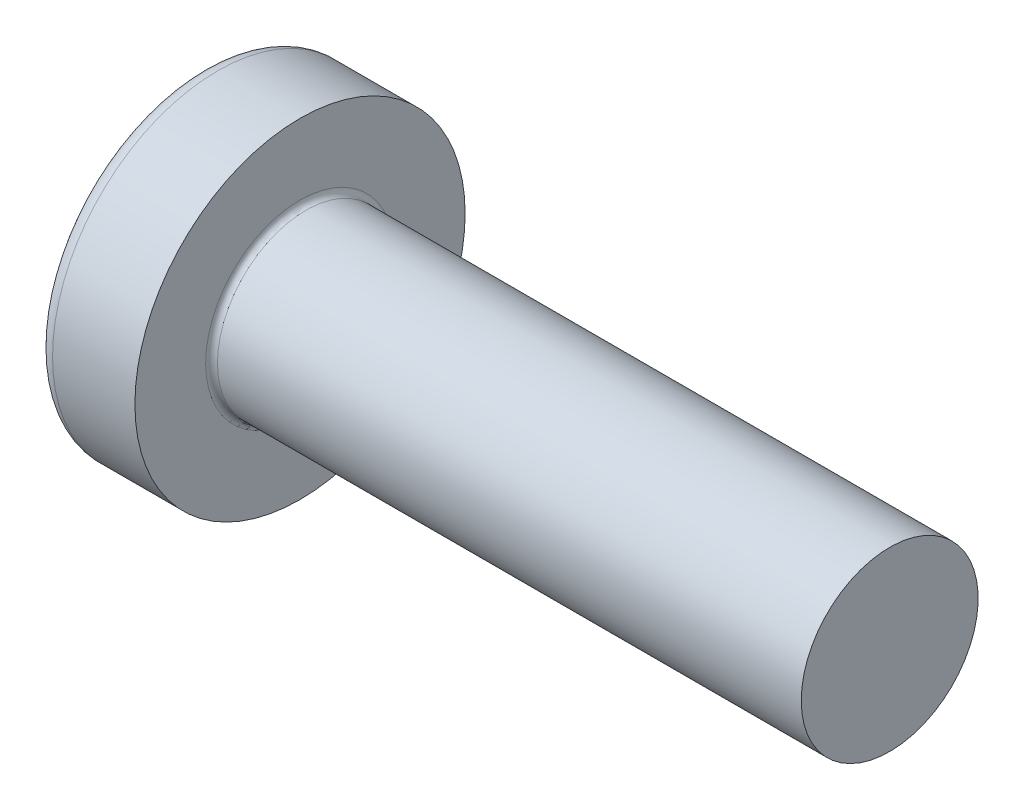
ISO-10303-21;
HEADER;
FILE_DESCRIPTION(('STEP AP214'),'2;1');
FILE_NAME('part.step','',(''),(''),'','','');
FILE_SCHEMA(('AUTOMOTIVE_DESIGN { 1 0 10303 214 1 1 1 1 }'));
ENDSEC;
DATA;
#1=APPLICATION_CONTEXT('core data for automotive mechanical design processes');
#2=APPLICATION_PROTOCOL_DEFINITION('international standard','automotive_design',2000,#1);
#3=PRODUCT_CONTEXT('',#1,'mechanical');
#4=PRODUCT('Part','Part','',(#3));
#5=PRODUCT_RELATED_PRODUCT_CATEGORY('part','',(#4));
#6=PRODUCT_DEFINITION_FORMATION('','',#4);
#7=PRODUCT_DEFINITION_CONTEXT('part definition',#1,'design');
#8=PRODUCT_DEFINITION('design','',#6,#7);
#9=PRODUCT_DEFINITION_SHAPE('','',#8);
#10=(LENGTH_UNIT() NAMED_UNIT(*) SI_UNIT(.MILLI.,.METRE.));
#11=(NAMED_UNIT(*) PLANE_ANGLE_UNIT() SI_UNIT($,.RADIAN.));
#12=(NAMED_UNIT(*) SI_UNIT($,.STERADIAN.) SOLID_ANGLE_UNIT());
#13=UNCERTAINTY_MEASURE_WITH_UNIT(LENGTH_MEASURE(1.E-05),#10,'distance_accuracy_value','');
#14=(GEOMETRIC_REPRESENTATION_CONTEXT(3) GLOBAL_UNCERTAINTY_ASSIGNED_CONTEXT((#13)) GLOBAL_UNIT_ASSIGNED_CONTEXT((#10,
#11,#12)) REPRESENTATION_CONTEXT('',''));
#15=CARTESIAN_POINT('',(0.,0.,0.));
#16=DIRECTION('',(0.,0.,1.));
#17=DIRECTION('',(1.,0.,0.));
#18=AXIS2_PLACEMENT_3D('',#15,#16,#17);
#19=CARTESIAN_POINT('',(5.,0.,0.));
#20=DIRECTION('',(-1.,0.,0.));
#21=DIRECTION('',(0.,1.,0.));
#22=AXIS2_PLACEMENT_3D('',#19,#20,#21);
#23=SPHERICAL_SURFACE('',#22,5.);
#24=CARTESIAN_POINT('',(0.775371598933733,0.,0.));
#25=DIRECTION('',(-1.,0.,0.));
#26=DIRECTION('',(0.,0.,1.));
#27=AXIS2_PLACEMENT_3D('',#24,#25,#26);
#28=CIRCLE('',#27,2.67441860465116);
#29=CARTESIAN_POINT('',(0.775371598933733,0.,2.67441860465116));
#30=VERTEX_POINT('',#29);
#31=EDGE_CURVE('E239',#30,#30,#28,.T.);
#32=ORIENTED_EDGE('',*,*,#31,.T.);
#33=EDGE_LOOP('',(#32));
#34=FACE_BOUND('',#33,.T.);
#35=CARTESIAN_POINT('',(0.0457951200896417,0.,0.));
#36=DIRECTION('',(1.,0.,0.));
#37=DIRECTION('',(0.,0.,-1.));
#38=AXIS2_PLACEMENT_3D('',#35,#36,#37);
#39=CIRCLE('',#38,0.675169614150692);
#40=CARTESIAN_POINT('',(0.0457951200896426,-0.369999999999998,-0.564760133040918));
#41=VERTEX_POINT('',#40);
#42=CARTESIAN_POINT('',(0.0457951200896417,-0.564760133040915,-0.37));
#43=VERTEX_POINT('',#42);
#44=EDGE_CURVE('E375',#41,#43,#39,.F.);
#45=ORIENTED_EDGE('',*,*,#44,.F.);
#46=CARTESIAN_POINT('',(5.,-0.37,0.));
#47=DIRECTION('',(0.,1.,0.));
#48=DIRECTION('',(0.,0.,1.));
#49=AXIS2_PLACEMENT_3D('',#46,#47,#48);
#50=CIRCLE('',#49,4.98629120689917);
#51=CARTESIAN_POINT('',(0.187869731256034,-0.369999999999995,-1.30633161051784));
#52=VERTEX_POINT('',#51);
#53=EDGE_CURVE('E301',#52,#41,#50,.T.);
#54=ORIENTED_EDGE('',*,*,#53,.F.);
#55=CARTESIAN_POINT('',(4.56358245832426,0.,0.875318202045668));
#56=DIRECTION('',(0.446197800778958,0.,-0.894934367749961));
#57=DIRECTION('',(-0.89493436774996,0.,-0.446197800778958));
#58=AXIS2_PLACEMENT_3D('',#55,#56,#57);
#59=CIRCLE('',#58,4.90340267309195);
#60=CARTESIAN_POINT('',(0.187869731256034,0.370000000000005,-1.30633161051784));
#61=VERTEX_POINT('',#60);
#62=EDGE_CURVE('E273',#52,#61,#59,.T.);
#63=ORIENTED_EDGE('',*,*,#62,.T.);
#64=CARTESIAN_POINT('',(5.,0.37,0.));
#65=DIRECTION('',(0.,-1.,0.));
#66=DIRECTION('',(0.,0.,-1.));
#67=AXIS2_PLACEMENT_3D('',#64,#65,#66);
#68=CIRCLE('',#67,4.98629120689917);
#69=CARTESIAN_POINT('',(0.0457951200896421,0.370000000000002,-0.564760133040916));
#70=VERTEX_POINT('',#69);
#71=EDGE_CURVE('E328',#70,#61,#68,.T.);
#72=ORIENTED_EDGE('',*,*,#71,.F.);
#73=CARTESIAN_POINT('',(0.0457951200896417,0.564760133040916,-0.37));
#74=VERTEX_POINT('',#73);
#75=EDGE_CURVE('E394',#74,#70,#39,.F.);
#76=ORIENTED_EDGE('',*,*,#75,.F.);
#77=CARTESIAN_POINT('',(5.,0.,-0.37));
#78=DIRECTION('',(0.,0.,1.));
#79=DIRECTION('',(1.,0.,0.));
#80=AXIS2_PLACEMENT_3D('',#77,#78,#79);
#81=CIRCLE('',#80,4.98629120689917);
#82=CARTESIAN_POINT('',(0.187869731256034,1.30633161051784,-0.37));
#83=VERTEX_POINT('',#82);
#84=EDGE_CURVE('E267',#83,#74,#81,.T.);
#85=ORIENTED_EDGE('',*,*,#84,.F.);
#86=CARTESIAN_POINT('',(4.56358245832426,-0.875318202045668,0.));
#87=DIRECTION('',(0.446197800778958,0.894934367749961,0.));
#88=DIRECTION('',(-0.89493436774996,0.446197800778958,0.));
#89=AXIS2_PLACEMENT_3D('',#86,#87,#88);
#90=CIRCLE('',#89,4.90340267309195);
#91=CARTESIAN_POINT('',(0.187869731256034,1.30633161051784,0.37));
#92=VERTEX_POINT('',#91);
#93=EDGE_CURVE('E270',#83,#92,#90,.T.);
#94=ORIENTED_EDGE('',*,*,#93,.T.);
#95=CARTESIAN_POINT('',(5.,0.,0.37));
#96=DIRECTION('',(0.,0.,-1.));
#97=DIRECTION('',(0.,1.,0.));
#98=AXIS2_PLACEMENT_3D('',#95,#96,#97);
#99=CIRCLE('',#98,4.98629120689917);
#100=CARTESIAN_POINT('',(0.0457951200896417,0.564760133040916,0.37));
#101=VERTEX_POINT('',#100);
#102=EDGE_CURVE('E263',#101,#92,#99,.T.);
#103=ORIENTED_EDGE('',*,*,#102,.F.);
#104=CARTESIAN_POINT('',(0.0457951200896426,0.369999999999998,0.564760133040918));
#105=VERTEX_POINT('',#104);
#106=EDGE_CURVE('E393',#105,#101,#39,.F.);
#107=ORIENTED_EDGE('',*,*,#106,.F.);
#108=CARTESIAN_POINT('',(0.187869731256034,0.369999999999995,1.30633161051784));
#109=VERTEX_POINT('',#108);
#110=EDGE_CURVE('E283',#109,#105,#68,.T.);
#111=ORIENTED_EDGE('',*,*,#110,.F.);
#112=CARTESIAN_POINT('',(4.56358245832426,0.,-0.875318202045668));
#113=DIRECTION('',(0.446197800778958,0.,0.894934367749961));
#114=DIRECTION('',(0.89493436774996,0.,-0.446197800778958));
#115=AXIS2_PLACEMENT_3D('',#112,#113,#114);
#116=CIRCLE('',#115,4.90340267309195);
#117=CARTESIAN_POINT('',(0.187869731256034,-0.370000000000005,1.30633161051784));
#118=VERTEX_POINT('',#117);
#119=EDGE_CURVE('E50',#109,#118,#116,.T.);
#120=ORIENTED_EDGE('',*,*,#119,.T.);
#121=CARTESIAN_POINT('',(0.0457951200896421,-0.370000000000002,0.564760133040916));
#122=VERTEX_POINT('',#121);
#123=EDGE_CURVE('E280',#122,#118,#50,.T.);
#124=ORIENTED_EDGE('',*,*,#123,.F.);
#125=CARTESIAN_POINT('',(0.0457951200896417,-0.564760133040916,0.37));
#126=VERTEX_POINT('',#125);
#127=EDGE_CURVE('E429',#126,#122,#39,.F.);
#128=ORIENTED_EDGE('',*,*,#127,.F.);
#129=CARTESIAN_POINT('',(0.187869731256034,-1.30633161051784,0.37));
#130=VERTEX_POINT('',#129);
#131=EDGE_CURVE('E264',#130,#126,#99,.T.);
#132=ORIENTED_EDGE('',*,*,#131,.F.);
#133=CARTESIAN_POINT('',(4.56358245832426,0.875318202045668,0.));
#134=DIRECTION('',(0.446197800778958,-0.894934367749961,0.));
#135=DIRECTION('',(0.89493436774996,0.446197800778958,0.));
#136=AXIS2_PLACEMENT_3D('',#133,#134,#135);
#137=CIRCLE('',#136,4.90340267309195);
#138=CARTESIAN_POINT('',(0.187869731256034,-1.30633161051784,-0.37));
#139=VERTEX_POINT('',#138);
#140=EDGE_CURVE('E260',#130,#139,#137,.T.);
#141=ORIENTED_EDGE('',*,*,#140,.T.);
#142=EDGE_CURVE('E65',#43,#139,#81,.T.);
#143=ORIENTED_EDGE('',*,*,#142,.F.);
#144=EDGE_LOOP('',(#45,#54,#63,#72,#76,#85,#94,#103,#107,#111,#120,#124,#128,#132,#141,#143));
#145=FACE_BOUND('',#144,.T.);
#146=ADVANCED_FACE('F37',(#34,#145),#23,.T.);
#147=CARTESIAN_POINT('',(1.75,0.527482216012805,-0.37));
#148=DIRECTION('',(0.,0.,1.));
#149=DIRECTION('',(1.,0.,0.));
#150=AXIS2_PLACEMENT_3D('',#147,#148,#149);
#151=PLANE('',#150);
#152=ORIENTED_EDGE('',*,*,#84,.T.);
#153=CARTESIAN_POINT('',(-0.987293237053716,0.649401255967161,-0.37));
#154=CARTESIAN_POINT('',(-0.781914975317084,0.632865887002871,-0.37));
#155=CARTESIAN_POINT('',(-0.576547882393372,0.616188977635081,-0.37));
#156=CARTESIAN_POINT('',(-0.165841599226327,0.582441031964227,-0.37));
#157=CARTESIAN_POINT('',(0.0394975903090452,0.56536998705488,-0.37));
#158=CARTESIAN_POINT('',(0.450133475422572,0.530723441326535,-0.37));
#159=CARTESIAN_POINT('',(0.655430171010573,0.513147940624557,-0.37));
#160=CARTESIAN_POINT('',(1.06596140177934,0.477314957985794,-0.37));
#161=CARTESIAN_POINT('',(1.2711959378071,0.459057485806066,-0.37));
#162=CARTESIAN_POINT('',(1.61065292365626,0.428051938688768,-0.37));
#163=CARTESIAN_POINT('',(1.74490059995643,0.415580824990931,-0.37));
#164=CARTESIAN_POINT('',(2.01334321762763,0.390092023404979,-0.37));
#165=CARTESIAN_POINT('',(2.14753815934577,0.377074339177353,-0.37));
#166=CARTESIAN_POINT('',(2.41586354151957,0.350315629452843,-0.37));
#167=CARTESIAN_POINT('',(2.5499939784531,0.33657456817765,-0.37));
#168=CARTESIAN_POINT('',(2.81814173295471,0.308004077741875,-0.37));
#169=CARTESIAN_POINT('',(2.95215904765134,0.293174621747065,-0.37));
#170=CARTESIAN_POINT('',(3.0860955068368,0.277618485071816,-0.37));
#171=B_SPLINE_CURVE_WITH_KNOTS('',3,(#153,#154,#155,#156,#157,#158,#159,#160,#161,#162,#163,
#164,#165,#166,#167,#168,#169,#170),.UNSPECIFIED.,.F.,.F.,(4,2,2,2,2,2,2,2,4),(0.,
0.618128793984691,1.23627109812525,1.85441325887562,2.4725465791681,2.87702276218609,
3.28149623678161,3.68598973550942,4.09049321032311),.UNSPECIFIED.);
#172=CARTESIAN_POINT('',(1.75,0.415013252800437,-0.37));
#173=VERTEX_POINT('',#172);
#174=EDGE_CURVE('E415',#74,#173,#171,.T.);
#175=ORIENTED_EDGE('',*,*,#174,.T.);
#176=DIRECTION('',(0.,1.,0.));
#177=VECTOR('',#176,1.);
#178=CARTESIAN_POINT('',(1.75,-0.527482216012805,-0.37));
#179=LINE('',#178,#177);
#180=CARTESIAN_POINT('',(1.75,0.527482216012805,-0.37));
#181=VERTEX_POINT('',#180);
#182=EDGE_CURVE('E357',#173,#181,#179,.T.);
#183=ORIENTED_EDGE('',*,*,#182,.T.);
#184=DIRECTION('',(0.89493436774996,-0.446197800778958,0.));
#185=VECTOR('',#184,1.);
#186=CARTESIAN_POINT('',(0.,1.4,-0.37));
#187=LINE('',#186,#185);
#188=EDGE_CURVE('E240',#83,#181,#187,.T.);
#189=ORIENTED_EDGE('',*,*,#188,.F.);
#190=EDGE_LOOP('',(#152,#175,#183,#189));
#191=FACE_BOUND('',#190,.T.);
#192=ADVANCED_FACE('F195',(#191),#151,.T.);
#193=CARTESIAN_POINT('',(1.75,-0.527482216012805,-0.37));
#194=VERTEX_POINT('',#193);
#195=CARTESIAN_POINT('',(1.75,-0.415013252800437,-0.37));
#196=VERTEX_POINT('',#195);
#197=EDGE_CURVE('E248',#194,#196,#179,.T.);
#198=ORIENTED_EDGE('',*,*,#197,.T.);
#199=CARTESIAN_POINT('',(-0.987293237053716,-0.649401255967161,-0.37));
#200=CARTESIAN_POINT('',(-0.781914975317084,-0.632865887002871,-0.37));
#201=CARTESIAN_POINT('',(-0.576547882393372,-0.616188977635081,-0.37));
#202=CARTESIAN_POINT('',(-0.165841599226327,-0.582441031964227,-0.37));
#203=CARTESIAN_POINT('',(0.0394975903090452,-0.56536998705488,-0.37));
#204=CARTESIAN_POINT('',(0.450133475422572,-0.530723441326535,-0.37));
#205=CARTESIAN_POINT('',(0.655430171010573,-0.513147940624557,-0.37));
#206=CARTESIAN_POINT('',(1.06596140177934,-0.477314957985794,-0.37));
#207=CARTESIAN_POINT('',(1.2711959378071,-0.459057485806066,-0.37));
#208=CARTESIAN_POINT('',(1.61065292365626,-0.428051938688768,-0.37));
#209=CARTESIAN_POINT('',(1.74490059995643,-0.415580824990931,-0.37));
#210=CARTESIAN_POINT('',(2.01334321762763,-0.390092023404979,-0.37));
#211=CARTESIAN_POINT('',(2.14753815934577,-0.377074339177353,-0.37));
#212=CARTESIAN_POINT('',(2.41586354151957,-0.350315629452843,-0.37));
#213=CARTESIAN_POINT('',(2.5499939784531,-0.33657456817765,-0.37));
#214=CARTESIAN_POINT('',(2.81814173295471,-0.308004077741875,-0.37));
#215=CARTESIAN_POINT('',(2.95215904765134,-0.293174621747065,-0.37));
#216=CARTESIAN_POINT('',(3.0860955068368,-0.277618485071816,-0.37));
#217=B_SPLINE_CURVE_WITH_KNOTS('',3,(#199,#200,#201,#202,#203,#204,#205,#206,#207,#208,#209,
#210,#211,#212,#213,#214,#215,#216),.UNSPECIFIED.,.F.,.F.,(4,2,2,2,2,2,2,2,4),(0.,
0.618128793984691,1.23627109812525,1.85441325887562,2.4725465791681,2.87702276218609,
3.28149623678161,3.68598973550942,4.09049321032311),.UNSPECIFIED.);
#218=EDGE_CURVE('E392',#196,#43,#217,.F.);
#219=ORIENTED_EDGE('',*,*,#218,.T.);
#220=ORIENTED_EDGE('',*,*,#142,.T.);
#221=DIRECTION('',(0.89493436774996,0.446197800778958,0.));
#222=VECTOR('',#221,1.);
#223=CARTESIAN_POINT('',(0.,-1.4,-0.37));
#224=LINE('',#223,#222);
#225=EDGE_CURVE('E331',#139,#194,#224,.T.);
#226=ORIENTED_EDGE('',*,*,#225,.T.);
#227=EDGE_LOOP('',(#198,#219,#220,#226));
#228=FACE_BOUND('',#227,.T.);
#229=ADVANCED_FACE('F201',(#228),#151,.T.);
#230=CARTESIAN_POINT('',(1.75,-0.527482216012805,0.37));
#231=DIRECTION('',(0.,0.,-1.));
#232=DIRECTION('',(0.,1.,0.));
#233=AXIS2_PLACEMENT_3D('',#230,#231,#232);
#234=PLANE('',#233);
#235=DIRECTION('',(0.,-1.,0.));
#236=VECTOR('',#235,1.);
#237=CARTESIAN_POINT('',(1.75,0.527482216012805,0.37));
#238=LINE('',#237,#236);
#239=CARTESIAN_POINT('',(1.75,0.527482216012805,0.37));
#240=VERTEX_POINT('',#239);
#241=CARTESIAN_POINT('',(1.75,0.415013252800437,0.37));
#242=VERTEX_POINT('',#241);
#243=EDGE_CURVE('E340',#240,#242,#238,.T.);
#244=ORIENTED_EDGE('',*,*,#243,.T.);
#245=CARTESIAN_POINT('',(-0.987293237069635,0.649401255968442,0.37));
#246=CARTESIAN_POINT('',(-0.781914975331301,0.632865887004023,0.37));
#247=CARTESIAN_POINT('',(-0.576547882405888,0.616188977636102,0.37));
#248=CARTESIAN_POINT('',(-0.16584159923544,0.582441031964983,0.37));
#249=CARTESIAN_POINT('',(0.0394975903016338,0.5653699870555,0.37));
#250=CARTESIAN_POINT('',(0.450133475420601,0.530723441326706,0.37));
#251=CARTESIAN_POINT('',(0.655430171012341,0.513147940624409,0.37));
#252=CARTESIAN_POINT('',(1.06596140178858,0.477314957984981,0.37));
#253=CARTESIAN_POINT('',(1.27119593782008,0.459057485804908,0.37));
#254=CARTESIAN_POINT('',(1.61065292367297,0.428051938687225,0.37));
#255=CARTESIAN_POINT('',(1.74490059997313,0.415580824989367,0.37));
#256=CARTESIAN_POINT('',(2.01334321764434,0.39009202340337,0.37));
#257=CARTESIAN_POINT('',(2.14753815936247,0.377074339175718,0.37));
#258=CARTESIAN_POINT('',(2.41586354153627,0.350315629451146,0.37));
#259=CARTESIAN_POINT('',(2.54999397846979,0.336574568175918,0.37));
#260=CARTESIAN_POINT('',(2.8181417329714,0.308004077740054,0.37));
#261=CARTESIAN_POINT('',(2.95215904766802,0.29317462174519,0.37));
#262=CARTESIAN_POINT('',(3.08609550685347,0.277618485069873,0.37));
#263=B_SPLINE_CURVE_WITH_KNOTS('',3,(#245,#246,#247,#248,#249,#250,#251,#252,#253,#254,#255,
#256,#257,#258,#259,#260,#261,#262),.UNSPECIFIED.,.F.,.F.,(4,2,2,2,2,2,2,2,4),(0.,
0.61812879398981,1.23627109813549,1.85441325889711,2.47254657920086,2.87702276221884,
3.28149623681436,3.68598973554218,4.09049321035586),.UNSPECIFIED.);
#264=EDGE_CURVE('E667',#242,#101,#263,.F.);
#265=ORIENTED_EDGE('',*,*,#264,.T.);
#266=ORIENTED_EDGE('',*,*,#102,.T.);
#267=DIRECTION('',(0.89493436774996,-0.446197800778958,0.));
#268=VECTOR('',#267,1.);
#269=CARTESIAN_POINT('',(0.,1.4,0.37));
#270=LINE('',#269,#268);
#271=EDGE_CURVE('E245',#92,#240,#270,.T.);
#272=ORIENTED_EDGE('',*,*,#271,.T.);
#273=EDGE_LOOP('',(#244,#265,#266,#272));
#274=FACE_BOUND('',#273,.T.);
#275=ADVANCED_FACE('F411',(#274),#234,.T.);
#276=ORIENTED_EDGE('',*,*,#131,.T.);
#277=CARTESIAN_POINT('',(-0.987293237069635,-0.649401255968442,0.37));
#278=CARTESIAN_POINT('',(-0.781914975331301,-0.632865887004023,0.37));
#279=CARTESIAN_POINT('',(-0.576547882405888,-0.616188977636102,0.37));
#280=CARTESIAN_POINT('',(-0.16584159923544,-0.582441031964983,0.37));
#281=CARTESIAN_POINT('',(0.0394975903016338,-0.5653699870555,0.37));
#282=CARTESIAN_POINT('',(0.450133475420601,-0.530723441326706,0.37));
#283=CARTESIAN_POINT('',(0.655430171012341,-0.513147940624409,0.37));
#284=CARTESIAN_POINT('',(1.06596140178858,-0.477314957984981,0.37));
#285=CARTESIAN_POINT('',(1.27119593782008,-0.459057485804908,0.37));
#286=CARTESIAN_POINT('',(1.61065292367297,-0.428051938687225,0.37));
#287=CARTESIAN_POINT('',(1.74490059997313,-0.415580824989367,0.37));
#288=CARTESIAN_POINT('',(2.01334321764434,-0.390092023403371,0.37));
#289=CARTESIAN_POINT('',(2.14753815936247,-0.377074339175718,0.37));
#290=CARTESIAN_POINT('',(2.41586354153627,-0.350315629451146,0.37));
#291=CARTESIAN_POINT('',(2.54999397846979,-0.336574568175918,0.37));
#292=CARTESIAN_POINT('',(2.8181417329714,-0.308004077740054,0.37));
#293=CARTESIAN_POINT('',(2.95215904766802,-0.29317462174519,0.37));
#294=CARTESIAN_POINT('',(3.08609550685347,-0.277618485069873,0.37));
#295=B_SPLINE_CURVE_WITH_KNOTS('',3,(#277,#278,#279,#280,#281,#282,#283,#284,#285,#286,#287,
#288,#289,#290,#291,#292,#293,#294),.UNSPECIFIED.,.F.,.F.,(4,2,2,2,2,2,2,2,4),(0.,
0.61812879398981,1.23627109813549,1.85441325889711,2.47254657920086,2.87702276221884,
3.28149623681436,3.68598973554218,4.09049321035586),.UNSPECIFIED.);
#296=CARTESIAN_POINT('',(1.75,-0.415013252800437,0.37));
#297=VERTEX_POINT('',#296);
#298=EDGE_CURVE('E430',#126,#297,#295,.T.);
#299=ORIENTED_EDGE('',*,*,#298,.T.);
#300=CARTESIAN_POINT('',(1.75,-0.527482216012806,0.37));
#301=VERTEX_POINT('',#300);
#302=EDGE_CURVE('E342',#297,#301,#238,.T.);
#303=ORIENTED_EDGE('',*,*,#302,.T.);
#304=DIRECTION('',(0.89493436774996,0.446197800778958,0.));
#305=VECTOR('',#304,1.);
#306=CARTESIAN_POINT('',(0.,-1.4,0.37));
#307=LINE('',#306,#305);
#308=EDGE_CURVE('E333',#130,#301,#307,.T.);
#309=ORIENTED_EDGE('',*,*,#308,.F.);
#310=EDGE_LOOP('',(#276,#299,#303,#309));
#311=FACE_BOUND('',#310,.T.);
#312=ADVANCED_FACE('F521',(#311),#234,.T.);
#313=CARTESIAN_POINT('',(1.75,0.527482216012805,0.37));
#314=DIRECTION('',(0.446197800778958,0.894934367749961,0.));
#315=DIRECTION('',(-0.89493436774996,0.446197800778958,0.));
#316=AXIS2_PLACEMENT_3D('',#313,#314,#315);
#317=PLANE('',#316);
#318=CARTESIAN_POINT('',(2.66965234556629,0.0689604865315898,0.));
#319=DIRECTION('',(0.446197800778958,0.894934367749961,0.));
#320=DIRECTION('',(-0.89493436774996,0.446197800778958,0.));
#321=AXIS2_PLACEMENT_3D('',#318,#319,#320);
#322=ELLIPSE('',#321,1.10195891266117,0.486831719863514);
#323=CARTESIAN_POINT('',(1.75,0.527482216012806,0.175779725196677));
#324=VERTEX_POINT('',#323);
#325=CARTESIAN_POINT('',(1.75,0.527482216012806,-0.175779725196677));
#326=VERTEX_POINT('',#325);
#327=EDGE_CURVE('E306',#324,#326,#322,.F.);
#328=ORIENTED_EDGE('',*,*,#327,.F.);
#329=DIRECTION('',(0.,0.,-1.));
#330=VECTOR('',#329,1.);
#331=CARTESIAN_POINT('',(1.75,0.527482216012805,0.37));
#332=LINE('',#331,#330);
#333=EDGE_CURVE('E343',#240,#324,#332,.T.);
#334=ORIENTED_EDGE('',*,*,#333,.F.);
#335=ORIENTED_EDGE('',*,*,#271,.F.);
#336=ORIENTED_EDGE('',*,*,#93,.F.);
#337=ORIENTED_EDGE('',*,*,#188,.T.);
#338=EDGE_CURVE('E345',#326,#181,#332,.T.);
#339=ORIENTED_EDGE('',*,*,#338,.F.);
#340=EDGE_LOOP('',(#328,#334,#335,#336,#337,#339));
#341=FACE_BOUND('',#340,.T.);
#342=ADVANCED_FACE('F409',(#341),#317,.F.);
#343=CARTESIAN_POINT('',(0.,-1.4,-0.37));
#344=DIRECTION('',(0.446197800778958,-0.894934367749961,0.));
#345=DIRECTION('',(0.89493436774996,0.446197800778958,0.));
#346=AXIS2_PLACEMENT_3D('',#343,#344,#345);
#347=PLANE('',#346);
#348=CARTESIAN_POINT('',(2.66965234556629,-0.0689604865315897,0.));
#349=DIRECTION('',(0.446197800778958,-0.894934367749961,0.));
#350=DIRECTION('',(-0.89493436774996,-0.446197800778958,0.));
#351=AXIS2_PLACEMENT_3D('',#348,#349,#350);
#352=ELLIPSE('',#351,1.10195891266117,0.486831719863514);
#353=CARTESIAN_POINT('',(1.75,-0.527482216012806,-0.175779725196677));
#354=VERTEX_POINT('',#353);
#355=CARTESIAN_POINT('',(1.75,-0.527482216012806,0.175779725196677));
#356=VERTEX_POINT('',#355);
#357=EDGE_CURVE('E669',#354,#356,#352,.F.);
#358=ORIENTED_EDGE('',*,*,#357,.F.);
#359=DIRECTION('',(0.,0.,1.));
#360=VECTOR('',#359,1.);
#361=CARTESIAN_POINT('',(1.75,-0.527482216012805,-0.37));
#362=LINE('',#361,#360);
#363=EDGE_CURVE('E336',#194,#354,#362,.T.);
#364=ORIENTED_EDGE('',*,*,#363,.F.);
#365=ORIENTED_EDGE('',*,*,#225,.F.);
#366=ORIENTED_EDGE('',*,*,#140,.F.);
#367=ORIENTED_EDGE('',*,*,#308,.T.);
#368=EDGE_CURVE('E339',#356,#301,#362,.T.);
#369=ORIENTED_EDGE('',*,*,#368,.F.);
#370=EDGE_LOOP('',(#358,#364,#365,#366,#367,#369));
#371=FACE_BOUND('',#370,.T.);
#372=ADVANCED_FACE('F508',(#371),#347,.F.);
#373=CARTESIAN_POINT('',(1.75,0.527482216012805,-0.37));
#374=DIRECTION('',(-1.,0.,0.));
#375=DIRECTION('',(0.,0.,1.));
#376=AXIS2_PLACEMENT_3D('',#373,#374,#375);
#377=PLANE('',#376);
#378=DIRECTION('',(0.,1.,0.));
#379=VECTOR('',#378,1.);
#380=CARTESIAN_POINT('',(1.75,-0.370000000000002,0.527482216012804));
#381=LINE('',#380,#379);
#382=CARTESIAN_POINT('',(1.75,-0.370000000000002,0.527482216012804));
#383=VERTEX_POINT('',#382);
#384=CARTESIAN_POINT('',(1.75,-0.175779725196681,0.527482216012805));
#385=VERTEX_POINT('',#384);
#386=EDGE_CURVE('E321',#383,#385,#381,.T.);
#387=ORIENTED_EDGE('',*,*,#386,.T.);
#388=CARTESIAN_POINT('',(1.75,0.,0.));
#389=DIRECTION('',(-1.,0.,0.));
#390=DIRECTION('',(0.,0.,1.));
#391=AXIS2_PLACEMENT_3D('',#388,#389,#390);
#392=CIRCLE('',#391,0.556);
#393=CARTESIAN_POINT('',(1.75,-0.370000000000001,0.415013252800436));
#394=VERTEX_POINT('',#393);
#395=EDGE_CURVE('E695',#394,#385,#392,.T.);
#396=ORIENTED_EDGE('',*,*,#395,.F.);
#397=DIRECTION('',(0.,0.,-1.));
#398=VECTOR('',#397,1.);
#399=CARTESIAN_POINT('',(1.75,-0.370000000000002,0.527482216012804));
#400=LINE('',#399,#398);
#401=EDGE_CURVE('E317',#383,#394,#400,.T.);
#402=ORIENTED_EDGE('',*,*,#401,.F.);
#403=EDGE_LOOP('',(#387,#396,#402));
#404=FACE_BOUND('',#403,.T.);
#405=ADVANCED_FACE('F465',(#404),#377,.T.);
#406=ORIENTED_EDGE('',*,*,#302,.F.);
#407=EDGE_CURVE('E700',#356,#297,#392,.T.);
#408=ORIENTED_EDGE('',*,*,#407,.F.);
#409=ORIENTED_EDGE('',*,*,#368,.T.);
#410=EDGE_LOOP('',(#406,#408,#409));
#411=FACE_BOUND('',#410,.T.);
#412=ADVANCED_FACE('F495',(#411),#377,.T.);
#413=ORIENTED_EDGE('',*,*,#363,.T.);
#414=EDGE_CURVE('E386',#196,#354,#392,.T.);
#415=ORIENTED_EDGE('',*,*,#414,.F.);
#416=ORIENTED_EDGE('',*,*,#197,.F.);
#417=EDGE_LOOP('',(#413,#415,#416));
#418=FACE_BOUND('',#417,.T.);
#419=ADVANCED_FACE('F489',(#418),#377,.T.);
#420=CARTESIAN_POINT('',(1.75,-0.369999999999998,-0.415013252800438));
#421=VERTEX_POINT('',#420);
#422=CARTESIAN_POINT('',(1.75,-0.369999999999998,-0.527482216012807));
#423=VERTEX_POINT('',#422);
#424=EDGE_CURVE('E320',#421,#423,#400,.T.);
#425=ORIENTED_EDGE('',*,*,#424,.F.);
#426=CARTESIAN_POINT('',(1.75,-0.175779725196678,-0.527482216012806));
#427=VERTEX_POINT('',#426);
#428=EDGE_CURVE('E57',#427,#421,#392,.T.);
#429=ORIENTED_EDGE('',*,*,#428,.F.);
#430=DIRECTION('',(0.,-1.,0.));
#431=VECTOR('',#430,1.);
#432=CARTESIAN_POINT('',(1.75,0.370000000000002,-0.527482216012804));
#433=LINE('',#432,#431);
#434=EDGE_CURVE('E316',#427,#423,#433,.T.);
#435=ORIENTED_EDGE('',*,*,#434,.T.);
#436=EDGE_LOOP('',(#425,#429,#435));
#437=FACE_BOUND('',#436,.T.);
#438=ADVANCED_FACE('F381',(#437),#377,.T.);
#439=CARTESIAN_POINT('',(1.75,0.370000000000002,-0.527482216012804));
#440=VERTEX_POINT('',#439);
#441=CARTESIAN_POINT('',(1.75,0.175779725196681,-0.527482216012805));
#442=VERTEX_POINT('',#441);
#443=EDGE_CURVE('E313',#440,#442,#433,.T.);
#444=ORIENTED_EDGE('',*,*,#443,.T.);
#445=CARTESIAN_POINT('',(1.75,0.370000000000001,-0.415013252800436));
#446=VERTEX_POINT('',#445);
#447=EDGE_CURVE('E385',#446,#442,#392,.T.);
#448=ORIENTED_EDGE('',*,*,#447,.F.);
#449=DIRECTION('',(0.,0.,1.));
#450=VECTOR('',#449,1.);
#451=CARTESIAN_POINT('',(1.75,0.370000000000002,-0.527482216012804));
#452=LINE('',#451,#450);
#453=EDGE_CURVE('E325',#440,#446,#452,.T.);
#454=ORIENTED_EDGE('',*,*,#453,.F.);
#455=EDGE_LOOP('',(#444,#448,#454));
#456=FACE_BOUND('',#455,.T.);
#457=ADVANCED_FACE('F477',(#456),#377,.T.);
#458=ORIENTED_EDGE('',*,*,#182,.F.);
#459=EDGE_CURVE('E684',#326,#173,#392,.T.);
#460=ORIENTED_EDGE('',*,*,#459,.F.);
#461=ORIENTED_EDGE('',*,*,#338,.T.);
#462=EDGE_LOOP('',(#458,#460,#461));
#463=FACE_BOUND('',#462,.T.);
#464=ADVANCED_FACE('F471',(#463),#377,.T.);
#465=ORIENTED_EDGE('',*,*,#333,.T.);
#466=EDGE_CURVE('E686',#242,#324,#392,.T.);
#467=ORIENTED_EDGE('',*,*,#466,.F.);
#468=ORIENTED_EDGE('',*,*,#243,.F.);
#469=EDGE_LOOP('',(#465,#467,#468));
#470=FACE_BOUND('',#469,.T.);
#471=ADVANCED_FACE('F463',(#470),#377,.T.);
#472=CARTESIAN_POINT('',(1.75,0.369999999999999,0.415013252800439));
#473=VERTEX_POINT('',#472);
#474=CARTESIAN_POINT('',(1.75,0.369999999999998,0.527482216012807));
#475=VERTEX_POINT('',#474);
#476=EDGE_CURVE('E298',#473,#475,#452,.T.);
#477=ORIENTED_EDGE('',*,*,#476,.F.);
#478=CARTESIAN_POINT('',(1.75,0.175779725196677,0.527482216012806));
#479=VERTEX_POINT('',#478);
#480=EDGE_CURVE('E387',#479,#473,#392,.T.);
#481=ORIENTED_EDGE('',*,*,#480,.F.);
#482=EDGE_CURVE('E324',#479,#475,#381,.T.);
#483=ORIENTED_EDGE('',*,*,#482,.T.);
#484=EDGE_LOOP('',(#477,#481,#483));
#485=FACE_BOUND('',#484,.T.);
#486=ADVANCED_FACE('F457',(#485),#377,.T.);
#487=CARTESIAN_POINT('',(1.75,0.369999999999998,0.527482216012807));
#488=DIRECTION('',(0.,-1.,0.));
#489=DIRECTION('',(1.,0.,0.));
#490=AXIS2_PLACEMENT_3D('',#487,#488,#489);
#491=PLANE('',#490);
#492=ORIENTED_EDGE('',*,*,#110,.T.);
#493=CARTESIAN_POINT('',(-0.987293237069635,0.369999999999998,0.649401255968443));
#494=CARTESIAN_POINT('',(-0.781914975331301,0.369999999999998,0.632865887004024));
#495=CARTESIAN_POINT('',(-0.576547882405888,0.369999999999998,0.616188977636103));
#496=CARTESIAN_POINT('',(-0.16584159923544,0.369999999999998,0.582441031964984));
#497=CARTESIAN_POINT('',(0.0394975903016338,0.369999999999998,0.565369987055501));
#498=CARTESIAN_POINT('',(0.450133475420601,0.369999999999998,0.530723441326707));
#499=CARTESIAN_POINT('',(0.655430171012341,0.369999999999998,0.51314794062441));
#500=CARTESIAN_POINT('',(1.06596140178858,0.369999999999998,0.477314957984982));
#501=CARTESIAN_POINT('',(1.27119593782008,0.369999999999998,0.459057485804909));
#502=CARTESIAN_POINT('',(1.61065292367297,0.369999999999999,0.428051938687226));
#503=CARTESIAN_POINT('',(1.74490059997313,0.369999999999999,0.415580824989369));
#504=CARTESIAN_POINT('',(2.01334321764434,0.369999999999999,0.390092023403372));
#505=CARTESIAN_POINT('',(2.14753815936247,0.369999999999999,0.37707433917572));
#506=CARTESIAN_POINT('',(2.41586354153627,0.369999999999999,0.350315629451147));
#507=CARTESIAN_POINT('',(2.54999397846979,0.369999999999999,0.336574568175919));
#508=CARTESIAN_POINT('',(2.8181417329714,0.369999999999999,0.308004077740055));
#509=CARTESIAN_POINT('',(2.95215904766802,0.369999999999999,0.293174621745191));
#510=CARTESIAN_POINT('',(3.08609550685347,0.369999999999999,0.277618485069875));
#511=B_SPLINE_CURVE_WITH_KNOTS('',3,(#493,#494,#495,#496,#497,#498,#499,#500,#501,#502,#503,
#504,#505,#506,#507,#508,#509,#510),.UNSPECIFIED.,.F.,.F.,(4,2,2,2,2,2,2,2,4),(0.,
0.61812879398981,1.23627109813549,1.85441325889711,2.47254657920086,2.87702276221884,
3.28149623681436,3.68598973554218,4.09049321035586),.UNSPECIFIED.);
#512=EDGE_CURVE('E666',#105,#473,#511,.T.);
#513=ORIENTED_EDGE('',*,*,#512,.T.);
#514=ORIENTED_EDGE('',*,*,#476,.T.);
#515=DIRECTION('',(0.89493436774996,0.,-0.446197800778958));
#516=VECTOR('',#515,1.);
#517=CARTESIAN_POINT('',(0.,0.369999999999995,1.4));
#518=LINE('',#517,#516);
#519=EDGE_CURVE('E291',#109,#475,#518,.T.);
#520=ORIENTED_EDGE('',*,*,#519,.F.);
#521=EDGE_LOOP('',(#492,#513,#514,#520));
#522=FACE_BOUND('',#521,.T.);
#523=ADVANCED_FACE('F295',(#522),#491,.T.);
#524=CARTESIAN_POINT('',(1.75,-0.369999999999998,-0.527482216012807));
#525=DIRECTION('',(0.,1.,0.));
#526=DIRECTION('',(0.,0.,1.));
#527=AXIS2_PLACEMENT_3D('',#524,#525,#526);
#528=PLANE('',#527);
#529=ORIENTED_EDGE('',*,*,#401,.T.);
#530=CARTESIAN_POINT('',(-0.987293237053716,-0.370000000000002,0.649401255967159));
#531=CARTESIAN_POINT('',(-0.781914975317084,-0.370000000000002,0.63286588700287));
#532=CARTESIAN_POINT('',(-0.576547882393372,-0.370000000000002,0.616188977635079));
#533=CARTESIAN_POINT('',(-0.165841599226327,-0.370000000000002,0.582441031964225));
#534=CARTESIAN_POINT('',(0.039497590309045,-0.370000000000002,0.565369987054878));
#535=CARTESIAN_POINT('',(0.450133475422572,-0.370000000000002,0.530723441326534));
#536=CARTESIAN_POINT('',(0.655430171010573,-0.370000000000002,0.513147940624556));
#537=CARTESIAN_POINT('',(1.06596140177934,-0.370000000000002,0.477314957985792));
#538=CARTESIAN_POINT('',(1.2711959378071,-0.370000000000002,0.459057485806065));
#539=CARTESIAN_POINT('',(1.61065292365626,-0.370000000000001,0.428051938688767));
#540=CARTESIAN_POINT('',(1.74490059995642,-0.370000000000001,0.41558082499093));
#541=CARTESIAN_POINT('',(2.01334321762763,-0.370000000000001,0.390092023404978));
#542=CARTESIAN_POINT('',(2.14753815934577,-0.370000000000001,0.377074339177352));
#543=CARTESIAN_POINT('',(2.41586354151957,-0.370000000000001,0.350315629452841));
#544=CARTESIAN_POINT('',(2.5499939784531,-0.370000000000001,0.336574568177649));
#545=CARTESIAN_POINT('',(2.81814173295471,-0.370000000000001,0.308004077741874));
#546=CARTESIAN_POINT('',(2.95215904765134,-0.370000000000001,0.293174621747064));
#547=CARTESIAN_POINT('',(3.0860955068368,-0.370000000000001,0.277618485071814));
#548=B_SPLINE_CURVE_WITH_KNOTS('',3,(#530,#531,#532,#533,#534,#535,#536,#537,#538,#539,#540,
#541,#542,#543,#544,#545,#546,#547),.UNSPECIFIED.,.F.,.F.,(4,2,2,2,2,2,2,2,4),(0.,
0.618128793984691,1.23627109812525,1.85441325887562,2.4725465791681,2.87702276218609,
3.28149623678161,3.68598973550942,4.09049321032311),.UNSPECIFIED.);
#549=EDGE_CURVE('E423',#394,#122,#548,.F.);
#550=ORIENTED_EDGE('',*,*,#549,.T.);
#551=ORIENTED_EDGE('',*,*,#123,.T.);
#552=DIRECTION('',(0.89493436774996,0.,-0.446197800778958));
#553=VECTOR('',#552,1.);
#554=CARTESIAN_POINT('',(0.,-0.370000000000005,1.4));
#555=LINE('',#554,#553);
#556=EDGE_CURVE('E293',#118,#383,#555,.T.);
#557=ORIENTED_EDGE('',*,*,#556,.T.);
#558=EDGE_LOOP('',(#529,#550,#551,#557));
#559=FACE_BOUND('',#558,.T.);
#560=ADVANCED_FACE('F230',(#559),#528,.T.);
#561=CARTESIAN_POINT('',(1.75,-0.370000000000002,0.527482216012804));
#562=DIRECTION('',(0.446197800778958,0.,0.894934367749961));
#563=DIRECTION('',(-0.89493436774996,0.,0.446197800778958));
#564=AXIS2_PLACEMENT_3D('',#561,#562,#563);
#565=PLANE('',#564);
#566=CARTESIAN_POINT('',(2.66965234556629,0.,0.0689604865315898));
#567=DIRECTION('',(0.446197800778958,0.,0.894934367749961));
#568=DIRECTION('',(-0.89493436774996,0.,0.446197800778958));
#569=AXIS2_PLACEMENT_3D('',#566,#567,#568);
#570=ELLIPSE('',#569,1.10195891266117,0.486831719863514);
#571=EDGE_CURVE('E421',#385,#479,#570,.F.);
#572=ORIENTED_EDGE('',*,*,#571,.F.);
#573=ORIENTED_EDGE('',*,*,#386,.F.);
#574=ORIENTED_EDGE('',*,*,#556,.F.);
#575=ORIENTED_EDGE('',*,*,#119,.F.);
#576=ORIENTED_EDGE('',*,*,#519,.T.);
#577=ORIENTED_EDGE('',*,*,#482,.F.);
#578=EDGE_LOOP('',(#572,#573,#574,#575,#576,#577));
#579=FACE_BOUND('',#578,.T.);
#580=ADVANCED_FACE('F289',(#579),#565,.F.);
#581=CARTESIAN_POINT('',(0.,0.370000000000005,-1.4));
#582=DIRECTION('',(0.446197800778958,0.,-0.894934367749961));
#583=DIRECTION('',(0.89493436774996,0.,0.446197800778958));
#584=AXIS2_PLACEMENT_3D('',#581,#582,#583);
#585=PLANE('',#584);
#586=CARTESIAN_POINT('',(2.66965234556629,0.,-0.0689604865315897));
#587=DIRECTION('',(0.446197800778958,0.,-0.894934367749961));
#588=DIRECTION('',(-0.89493436774996,0.,-0.446197800778958));
#589=AXIS2_PLACEMENT_3D('',#586,#587,#588);
#590=ELLIPSE('',#589,1.10195891266117,0.486831719863514);
#591=EDGE_CURVE('E379',#442,#427,#590,.F.);
#592=ORIENTED_EDGE('',*,*,#591,.F.);
#593=ORIENTED_EDGE('',*,*,#443,.F.);
#594=DIRECTION('',(0.89493436774996,0.,0.446197800778958));
#595=VECTOR('',#594,1.);
#596=CARTESIAN_POINT('',(0.,0.370000000000005,-1.4));
#597=LINE('',#596,#595);
#598=EDGE_CURVE('E303',#61,#440,#597,.T.);
#599=ORIENTED_EDGE('',*,*,#598,.F.);
#600=ORIENTED_EDGE('',*,*,#62,.F.);
#601=DIRECTION('',(0.89493436774996,0.,0.446197800778958));
#602=VECTOR('',#601,1.);
#603=CARTESIAN_POINT('',(0.,-0.369999999999995,-1.4));
#604=LINE('',#603,#602);
#605=EDGE_CURVE('E310',#52,#423,#604,.T.);
#606=ORIENTED_EDGE('',*,*,#605,.T.);
#607=ORIENTED_EDGE('',*,*,#434,.F.);
#608=EDGE_LOOP('',(#592,#593,#599,#600,#606,#607));
#609=FACE_BOUND('',#608,.T.);
#610=ADVANCED_FACE('F370',(#609),#585,.F.);
#611=ORIENTED_EDGE('',*,*,#453,.T.);
#612=CARTESIAN_POINT('',(-0.987293237053716,0.370000000000002,-0.649401255967159));
#613=CARTESIAN_POINT('',(-0.781914975317084,0.370000000000002,-0.63286588700287));
#614=CARTESIAN_POINT('',(-0.576547882393372,0.370000000000002,-0.61618897763508));
#615=CARTESIAN_POINT('',(-0.165841599226327,0.370000000000002,-0.582441031964225));
#616=CARTESIAN_POINT('',(0.039497590309045,0.370000000000002,-0.565369987054878));
#617=CARTESIAN_POINT('',(0.450133475422572,0.370000000000002,-0.530723441326533));
#618=CARTESIAN_POINT('',(0.655430171010573,0.370000000000002,-0.513147940624555));
#619=CARTESIAN_POINT('',(1.06596140177934,0.370000000000002,-0.477314957985793));
#620=CARTESIAN_POINT('',(1.2711959378071,0.370000000000002,-0.459057485806065));
#621=CARTESIAN_POINT('',(1.61065292365626,0.370000000000001,-0.428051938688767));
#622=CARTESIAN_POINT('',(1.74490059995642,0.370000000000001,-0.41558082499093));
#623=CARTESIAN_POINT('',(2.01334321762763,0.370000000000001,-0.390092023404978));
#624=CARTESIAN_POINT('',(2.14753815934577,0.370000000000001,-0.377074339177352));
#625=CARTESIAN_POINT('',(2.41586354151957,0.370000000000001,-0.350315629452841));
#626=CARTESIAN_POINT('',(2.5499939784531,0.370000000000001,-0.336574568177649));
#627=CARTESIAN_POINT('',(2.81814173295471,0.370000000000001,-0.308004077741874));
#628=CARTESIAN_POINT('',(2.95215904765134,0.370000000000001,-0.293174621747064));
#629=CARTESIAN_POINT('',(3.0860955068368,0.370000000000001,-0.277618485071814));
#630=B_SPLINE_CURVE_WITH_KNOTS('',3,(#612,#613,#614,#615,#616,#617,#618,#619,#620,#621,#622,
#623,#624,#625,#626,#627,#628,#629),.UNSPECIFIED.,.F.,.F.,(4,2,2,2,2,2,2,2,4),(0.,
0.618128793984691,1.23627109812525,1.85441325887562,2.4725465791681,2.87702276218609,
3.28149623678161,3.68598973550942,4.09049321032311),.UNSPECIFIED.);
#631=EDGE_CURVE('E366',#446,#70,#630,.F.);
#632=ORIENTED_EDGE('',*,*,#631,.T.);
#633=ORIENTED_EDGE('',*,*,#71,.T.);
#634=ORIENTED_EDGE('',*,*,#598,.T.);
#635=EDGE_LOOP('',(#611,#632,#633,#634));
#636=FACE_BOUND('',#635,.T.);
#637=ADVANCED_FACE('F228',(#636),#491,.T.);
#638=ORIENTED_EDGE('',*,*,#53,.T.);
#639=CARTESIAN_POINT('',(-0.987293237053716,-0.369999999999998,-0.649401255967162));
#640=CARTESIAN_POINT('',(-0.781914975317084,-0.369999999999998,-0.632865887002873));
#641=CARTESIAN_POINT('',(-0.576547882393372,-0.369999999999998,-0.616188977635082));
#642=CARTESIAN_POINT('',(-0.165841599226327,-0.369999999999998,-0.582441031964228));
#643=CARTESIAN_POINT('',(0.0394975903090453,-0.369999999999998,-0.565369987054881));
#644=CARTESIAN_POINT('',(0.450133475422572,-0.369999999999998,-0.530723441326536));
#645=CARTESIAN_POINT('',(0.655430171010573,-0.369999999999998,-0.513147940624558));
#646=CARTESIAN_POINT('',(1.06596140177934,-0.369999999999998,-0.477314957985795));
#647=CARTESIAN_POINT('',(1.2711959378071,-0.369999999999998,-0.459057485806067));
#648=CARTESIAN_POINT('',(1.61065292365626,-0.369999999999998,-0.42805193868877));
#649=CARTESIAN_POINT('',(1.74490059995643,-0.369999999999998,-0.415580824990932));
#650=CARTESIAN_POINT('',(2.01334321762763,-0.369999999999999,-0.390092023404981));
#651=CARTESIAN_POINT('',(2.14753815934577,-0.369999999999999,-0.377074339177355));
#652=CARTESIAN_POINT('',(2.41586354151957,-0.369999999999999,-0.350315629452844));
#653=CARTESIAN_POINT('',(2.5499939784531,-0.369999999999999,-0.336574568177652));
#654=CARTESIAN_POINT('',(2.81814173295471,-0.369999999999999,-0.308004077741877));
#655=CARTESIAN_POINT('',(2.95215904765134,-0.369999999999999,-0.293174621747066));
#656=CARTESIAN_POINT('',(3.0860955068368,-0.369999999999999,-0.277618485071817));
#657=B_SPLINE_CURVE_WITH_KNOTS('',3,(#639,#640,#641,#642,#643,#644,#645,#646,#647,#648,#649,
#650,#651,#652,#653,#654,#655,#656),.UNSPECIFIED.,.F.,.F.,(4,2,2,2,2,2,2,2,4),(0.,
0.618128793984691,1.23627109812525,1.85441325887562,2.4725465791681,2.87702276218609,
3.28149623678161,3.68598973550942,4.09049321032311),.UNSPECIFIED.);
#658=EDGE_CURVE('E11',#41,#421,#657,.T.);
#659=ORIENTED_EDGE('',*,*,#658,.T.);
#660=ORIENTED_EDGE('',*,*,#424,.T.);
#661=ORIENTED_EDGE('',*,*,#605,.F.);
#662=EDGE_LOOP('',(#638,#659,#660,#661));
#663=FACE_BOUND('',#662,.T.);
#664=ADVANCED_FACE('F223',(#663),#528,.T.);
#665=CARTESIAN_POINT('',(-25.4,0.,0.));
#666=DIRECTION('',(-1.,0.,0.));
#667=DIRECTION('',(0.,0.,1.));
#668=AXIS2_PLACEMENT_3D('',#665,#666,#667);
#669=CYLINDRICAL_SURFACE('',#668,1.5);
#670=CARTESIAN_POINT('',(2.5,0.,0.));
#671=DIRECTION('',(-1.,0.,0.));
#672=DIRECTION('',(0.,0.,1.));
#673=AXIS2_PLACEMENT_3D('',#670,#671,#672);
#674=CIRCLE('',#673,1.5);
#675=CARTESIAN_POINT('',(2.5,0.,1.5));
#676=VERTEX_POINT('',#675);
#677=EDGE_CURVE('E234',#676,#676,#674,.F.);
#678=ORIENTED_EDGE('',*,*,#677,.T.);
#679=EDGE_LOOP('',(#678));
#680=FACE_BOUND('',#679,.T.);
#681=CARTESIAN_POINT('',(12.4,0.,0.));
#682=DIRECTION('',(-1.,0.,0.));
#683=DIRECTION('',(0.,0.,1.));
#684=AXIS2_PLACEMENT_3D('',#681,#682,#683);
#685=CIRCLE('',#684,1.5);
#686=CARTESIAN_POINT('',(12.4,0.,1.5));
#687=VERTEX_POINT('',#686);
#688=EDGE_CURVE('E237',#687,#687,#685,.T.);
#689=ORIENTED_EDGE('',*,*,#688,.T.);
#690=EDGE_LOOP('',(#689));
#691=FACE_BOUND('',#690,.T.);
#692=ADVANCED_FACE('F220',(#680,#691),#669,.T.);
#693=CARTESIAN_POINT('',(2.4,1.5,0.));
#694=DIRECTION('',(-1.,0.,0.));
#695=DIRECTION('',(0.,0.,1.));
#696=AXIS2_PLACEMENT_3D('',#693,#694,#695);
#697=PLANE('',#696);
#698=CARTESIAN_POINT('',(2.4,0.,0.));
#699=DIRECTION('',(-1.,0.,0.));
#700=DIRECTION('',(0.,0.,1.));
#701=AXIS2_PLACEMENT_3D('',#698,#699,#700);
#702=CIRCLE('',#701,1.6);
#703=CARTESIAN_POINT('',(2.4,0.,1.6));
#704=VERTEX_POINT('',#703);
#705=EDGE_CURVE('E256',#704,#704,#702,.T.);
#706=ORIENTED_EDGE('',*,*,#705,.T.);
#707=EDGE_LOOP('',(#706));
#708=FACE_BOUND('',#707,.T.);
#709=CARTESIAN_POINT('',(2.4,0.,0.));
#710=DIRECTION('',(-1.,0.,0.));
#711=DIRECTION('',(0.,0.,1.));
#712=AXIS2_PLACEMENT_3D('',#709,#710,#711);
#713=CIRCLE('',#712,2.8);
#714=CARTESIAN_POINT('',(2.4,0.,2.8));
#715=VERTEX_POINT('',#714);
#716=EDGE_CURVE('E253',#715,#715,#713,.T.);
#717=ORIENTED_EDGE('',*,*,#716,.F.);
#718=EDGE_LOOP('',(#717));
#719=FACE_BOUND('',#718,.T.);
#720=ADVANCED_FACE('F217',(#708,#719),#697,.F.);
#721=CARTESIAN_POINT('',(-25.4,0.,0.));
#722=DIRECTION('',(-1.,0.,0.));
#723=DIRECTION('',(0.,0.,1.));
#724=AXIS2_PLACEMENT_3D('',#721,#722,#723);
#725=CYLINDRICAL_SURFACE('',#724,2.8);
#726=ORIENTED_EDGE('',*,*,#716,.T.);
#727=EDGE_LOOP('',(#726));
#728=FACE_BOUND('',#727,.T.);
#729=CARTESIAN_POINT('',(1.00350153259131,0.,0.));
#730=DIRECTION('',(-1.,0.,0.));
#731=DIRECTION('',(0.,0.,1.));
#732=AXIS2_PLACEMENT_3D('',#729,#730,#731);
#733=CIRCLE('',#732,2.8);
#734=CARTESIAN_POINT('',(1.00350153259131,0.,2.8));
#735=VERTEX_POINT('',#734);
#736=EDGE_CURVE('E242',#735,#735,#733,.T.);
#737=ORIENTED_EDGE('',*,*,#736,.F.);
#738=EDGE_LOOP('',(#737));
#739=FACE_BOUND('',#738,.T.);
#740=ADVANCED_FACE('F213',(#728,#739),#725,.T.);
#741=CARTESIAN_POINT('',(1.00350153259131,0.,0.));
#742=DIRECTION('',(-1.,0.,0.));
#743=DIRECTION('',(0.,0.,1.));
#744=AXIS2_PLACEMENT_3D('',#741,#742,#743);
#745=TOROIDAL_SURFACE('',#744,2.53,0.27);
#746=ORIENTED_EDGE('',*,*,#736,.T.);
#747=EDGE_LOOP('',(#746));
#748=FACE_BOUND('',#747,.T.);
#749=ORIENTED_EDGE('',*,*,#31,.F.);
#750=EDGE_LOOP('',(#749));
#751=FACE_BOUND('',#750,.T.);
#752=ADVANCED_FACE('F210',(#748,#751),#745,.T.);
#753=CARTESIAN_POINT('',(12.4,1.5,0.));
#754=DIRECTION('',(1.,0.,0.));
#755=DIRECTION('',(0.,0.,-1.));
#756=AXIS2_PLACEMENT_3D('',#753,#754,#755);
#757=PLANE('',#756);
#758=ORIENTED_EDGE('',*,*,#688,.F.);
#759=EDGE_LOOP('',(#758));
#760=FACE_BOUND('',#759,.T.);
#761=ADVANCED_FACE('F208',(#760),#757,.T.);
#762=CARTESIAN_POINT('',(2.5,0.,0.));
#763=DIRECTION('',(-1.,0.,0.));
#764=DIRECTION('',(0.,0.,1.));
#765=AXIS2_PLACEMENT_3D('',#762,#763,#764);
#766=TOROIDAL_SURFACE('',#765,1.6,0.1);
#767=ORIENTED_EDGE('',*,*,#677,.F.);
#768=EDGE_LOOP('',(#767));
#769=FACE_BOUND('',#768,.T.);
#770=ORIENTED_EDGE('',*,*,#705,.F.);
#771=EDGE_LOOP('',(#770));
#772=FACE_BOUND('',#771,.T.);
#773=ADVANCED_FACE('F39',(#769,#772),#766,.F.);
#774=CARTESIAN_POINT('',(1.75,0.,0.));
#775=DIRECTION('',(-1.,0.,0.));
#776=DIRECTION('',(0.,0.,1.));
#777=AXIS2_PLACEMENT_3D('',#774,#775,#776);
#778=CONICAL_SURFACE('',#777,0.556,0.0698131700797659);
#779=ORIENTED_EDGE('',*,*,#327,.T.);
#780=EDGE_CURVE('E681',#324,#326,#392,.T.);
#781=ORIENTED_EDGE('',*,*,#780,.F.);
#782=EDGE_LOOP('',(#779,#781));
#783=FACE_BOUND('',#782,.T.);
#784=ADVANCED_FACE('F192',(#783),#778,.F.);
#785=ORIENTED_EDGE('',*,*,#357,.T.);
#786=EDGE_CURVE('E701',#354,#356,#392,.T.);
#787=ORIENTED_EDGE('',*,*,#786,.F.);
#788=EDGE_LOOP('',(#785,#787));
#789=FACE_BOUND('',#788,.T.);
#790=ADVANCED_FACE('F596',(#789),#778,.F.);
#791=EDGE_CURVE('E389',#473,#242,#392,.T.);
#792=ORIENTED_EDGE('',*,*,#791,.F.);
#793=ORIENTED_EDGE('',*,*,#512,.F.);
#794=ORIENTED_EDGE('',*,*,#106,.T.);
#795=ORIENTED_EDGE('',*,*,#264,.F.);
#796=EDGE_LOOP('',(#792,#793,#794,#795));
#797=FACE_BOUND('',#796,.T.);
#798=ADVANCED_FACE('F603',(#797),#778,.F.);
#799=ORIENTED_EDGE('',*,*,#571,.T.);
#800=EDGE_CURVE('E390',#385,#479,#392,.T.);
#801=ORIENTED_EDGE('',*,*,#800,.F.);
#802=EDGE_LOOP('',(#799,#801));
#803=FACE_BOUND('',#802,.T.);
#804=ADVANCED_FACE('F610',(#803),#778,.F.);
#805=ORIENTED_EDGE('',*,*,#591,.T.);
#806=EDGE_CURVE('E382',#442,#427,#392,.T.);
#807=ORIENTED_EDGE('',*,*,#806,.F.);
#808=EDGE_LOOP('',(#805,#807));
#809=FACE_BOUND('',#808,.T.);
#810=ADVANCED_FACE('F617',(#809),#778,.F.);
#811=ORIENTED_EDGE('',*,*,#127,.T.);
#812=ORIENTED_EDGE('',*,*,#549,.F.);
#813=EDGE_CURVE('E697',#297,#394,#392,.T.);
#814=ORIENTED_EDGE('',*,*,#813,.F.);
#815=ORIENTED_EDGE('',*,*,#298,.F.);
#816=EDGE_LOOP('',(#811,#812,#814,#815));
#817=FACE_BOUND('',#816,.T.);
#818=ADVANCED_FACE('F624',(#817),#778,.F.);
#819=ORIENTED_EDGE('',*,*,#75,.T.);
#820=ORIENTED_EDGE('',*,*,#631,.F.);
#821=EDGE_CURVE('E687',#173,#446,#392,.T.);
#822=ORIENTED_EDGE('',*,*,#821,.F.);
#823=ORIENTED_EDGE('',*,*,#174,.F.);
#824=EDGE_LOOP('',(#819,#820,#822,#823));
#825=FACE_BOUND('',#824,.T.);
#826=ADVANCED_FACE('F190',(#825),#778,.F.);
#827=EDGE_CURVE('E383',#421,#196,#392,.T.);
#828=ORIENTED_EDGE('',*,*,#827,.F.);
#829=ORIENTED_EDGE('',*,*,#658,.F.);
#830=ORIENTED_EDGE('',*,*,#44,.T.);
#831=ORIENTED_EDGE('',*,*,#218,.F.);
#832=EDGE_LOOP('',(#828,#829,#830,#831));
#833=FACE_BOUND('',#832,.T.);
#834=ADVANCED_FACE('F185',(#833),#778,.F.);
#835=CARTESIAN_POINT('',(1.93065535110549,0.,0.));
#836=DIRECTION('',(-1.,0.,0.));
#837=DIRECTION('',(0.,0.,1.));
#838=AXIS2_PLACEMENT_3D('',#835,#836,#837);
#839=CONICAL_SURFACE('',#838,0.,1.25663706143592);
#840=ORIENTED_EDGE('',*,*,#480,.T.);
#841=ORIENTED_EDGE('',*,*,#791,.T.);
#842=ORIENTED_EDGE('',*,*,#466,.T.);
#843=ORIENTED_EDGE('',*,*,#780,.T.);
#844=ORIENTED_EDGE('',*,*,#459,.T.);
#845=ORIENTED_EDGE('',*,*,#821,.T.);
#846=ORIENTED_EDGE('',*,*,#447,.T.);
#847=ORIENTED_EDGE('',*,*,#806,.T.);
#848=ORIENTED_EDGE('',*,*,#428,.T.);
#849=ORIENTED_EDGE('',*,*,#827,.T.);
#850=ORIENTED_EDGE('',*,*,#414,.T.);
#851=ORIENTED_EDGE('',*,*,#786,.T.);
#852=ORIENTED_EDGE('',*,*,#407,.T.);
#853=ORIENTED_EDGE('',*,*,#813,.T.);
#854=ORIENTED_EDGE('',*,*,#395,.T.);
#855=ORIENTED_EDGE('',*,*,#800,.T.);
#856=EDGE_LOOP('',(#840,#841,#842,#843,#844,#845,#846,#847,#848,#849,#850,#851,#852,#853,#854,#855));
#857=FACE_BOUND('',#856,.T.);
#858=CARTESIAN_POINT('',(1.93065535110549,0.,0.));
#859=VERTEX_POINT('',#858);
#860=VERTEX_LOOP('',#859);
#861=FACE_BOUND('',#860,.T.);
#862=ADVANCED_FACE('F183',(#857,#861),#839,.F.);
#863=CLOSED_SHELL('',(#146,#192,#229,#275,#312,#342,#372,#405,#412,#419,#438,#457,#464,#471,
#486,#523,#560,#580,#610,#637,#664,#692,#720,#740,#752,#761,#773,#784,#790,#798,#804,#810,#818,
#826,#834,#862));
#864=MANIFOLD_SOLID_BREP('B2',#863);
#865=ADVANCED_BREP_SHAPE_REPRESENTATION('',(#18,#864),#14);
#866=SHAPE_DEFINITION_REPRESENTATION(#9,#865);
ENDSEC;
END-ISO-10303-21;
